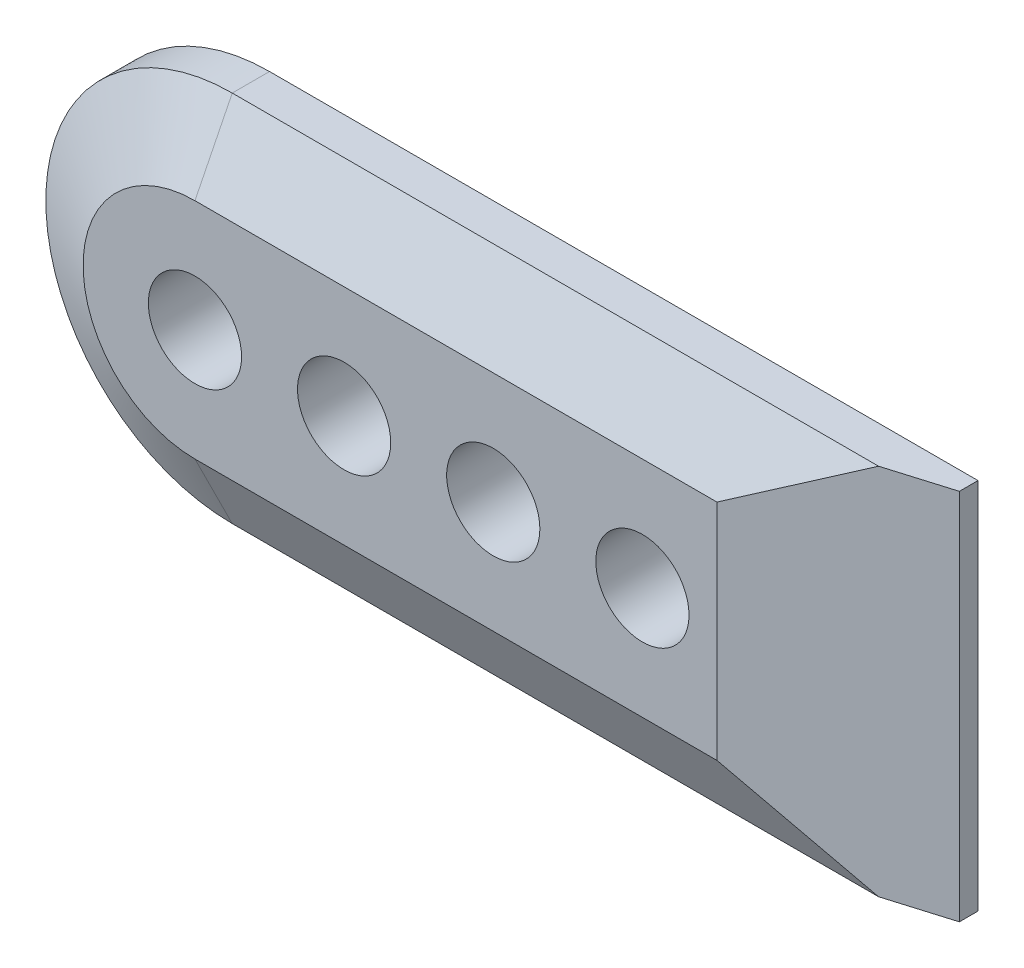
ISO-10303-21;
HEADER;
FILE_DESCRIPTION(('STEP AP214'),'2;1');
FILE_NAME('part.step','',(''),(''),'','','');
FILE_SCHEMA(('AUTOMOTIVE_DESIGN { 1 0 10303 214 1 1 1 1 }'));
ENDSEC;
DATA;
#1=APPLICATION_CONTEXT('core data for automotive mechanical design processes');
#2=APPLICATION_PROTOCOL_DEFINITION('international standard','automotive_design',2000,#1);
#3=PRODUCT_CONTEXT('',#1,'mechanical');
#4=PRODUCT('Part','Part','',(#3));
#5=PRODUCT_RELATED_PRODUCT_CATEGORY('part','',(#4));
#6=PRODUCT_DEFINITION_FORMATION('','',#4);
#7=PRODUCT_DEFINITION_CONTEXT('part definition',#1,'design');
#8=PRODUCT_DEFINITION('design','',#6,#7);
#9=PRODUCT_DEFINITION_SHAPE('','',#8);
#10=(LENGTH_UNIT() NAMED_UNIT(*) SI_UNIT(.MILLI.,.METRE.));
#11=(NAMED_UNIT(*) PLANE_ANGLE_UNIT() SI_UNIT($,.RADIAN.));
#12=(NAMED_UNIT(*) SI_UNIT($,.STERADIAN.) SOLID_ANGLE_UNIT());
#13=UNCERTAINTY_MEASURE_WITH_UNIT(LENGTH_MEASURE(1.E-05),#10,'distance_accuracy_value','');
#14=(GEOMETRIC_REPRESENTATION_CONTEXT(3) GLOBAL_UNCERTAINTY_ASSIGNED_CONTEXT((#13)) GLOBAL_UNIT_ASSIGNED_CONTEXT((#10,
#11,#12)) REPRESENTATION_CONTEXT('',''));
#15=CARTESIAN_POINT('',(0.,0.,0.));
#16=DIRECTION('',(0.,0.,1.));
#17=DIRECTION('',(1.,0.,0.));
#18=AXIS2_PLACEMENT_3D('',#15,#16,#17);
#19=CARTESIAN_POINT('',(0.,1250.,500.));
#20=DIRECTION('',(0.,0.,-1.));
#21=DIRECTION('',(-1.,0.,0.));
#22=AXIS2_PLACEMENT_3D('',#19,#20,#21);
#23=CYLINDRICAL_SURFACE('',#22,1250.);
#24=DIRECTION('',(0.,0.,-1.));
#25=VECTOR('',#24,1.);
#26=CARTESIAN_POINT('',(0.,0.,500.));
#27=LINE('',#26,#25);
#28=CARTESIAN_POINT('',(0.,0.,249.999999999999));
#29=VERTEX_POINT('',#28);
#30=CARTESIAN_POINT('',(0.,0.,0.));
#31=VERTEX_POINT('',#30);
#32=EDGE_CURVE('E100',#29,#31,#27,.T.);
#33=ORIENTED_EDGE('',*,*,#32,.F.);
#34=CARTESIAN_POINT('',(0.,1250.,249.999999999999));
#35=DIRECTION('',(0.,0.,1.));
#36=DIRECTION('',(1.,0.,0.));
#37=AXIS2_PLACEMENT_3D('',#34,#35,#36);
#38=CIRCLE('',#37,1250.);
#39=CARTESIAN_POINT('',(0.,2500.,249.999999999999));
#40=VERTEX_POINT('',#39);
#41=EDGE_CURVE('E163',#29,#40,#38,.F.);
#42=ORIENTED_EDGE('',*,*,#41,.T.);
#43=DIRECTION('',(0.,0.,-1.));
#44=VECTOR('',#43,1.);
#45=CARTESIAN_POINT('',(0.,2500.,500.));
#46=LINE('',#45,#44);
#47=CARTESIAN_POINT('',(0.,2500.,0.));
#48=VERTEX_POINT('',#47);
#49=EDGE_CURVE('E123',#40,#48,#46,.T.);
#50=ORIENTED_EDGE('',*,*,#49,.T.);
#51=CARTESIAN_POINT('',(0.,1250.,0.));
#52=DIRECTION('',(0.,0.,1.));
#53=DIRECTION('',(1.,0.,0.));
#54=AXIS2_PLACEMENT_3D('',#51,#52,#53);
#55=CIRCLE('',#54,1250.);
#56=EDGE_CURVE('E117',#48,#31,#55,.T.);
#57=ORIENTED_EDGE('',*,*,#56,.T.);
#58=EDGE_LOOP('',(#33,#42,#50,#57));
#59=FACE_BOUND('',#58,.T.);
#60=ADVANCED_FACE('F41',(#59),#23,.T.);
#61=CARTESIAN_POINT('',(0.,0.,500.));
#62=DIRECTION('',(0.,1.,0.));
#63=DIRECTION('',(0.,0.,1.));
#64=AXIS2_PLACEMENT_3D('',#61,#62,#63);
#65=PLANE('',#64);
#66=DIRECTION('',(0.,0.,-1.));
#67=VECTOR('',#66,1.);
#68=CARTESIAN_POINT('',(4750.,0.,500.));
#69=LINE('',#68,#67);
#70=CARTESIAN_POINT('',(4750.,0.,125.));
#71=VERTEX_POINT('',#70);
#72=CARTESIAN_POINT('',(4750.,0.,0.));
#73=VERTEX_POINT('',#72);
#74=EDGE_CURVE('E111',#71,#73,#69,.T.);
#75=ORIENTED_EDGE('',*,*,#74,.F.);
#76=DIRECTION('',(-0.957826285221152,0.,0.287347885566342));
#77=VECTOR('',#76,1.);
#78=CARTESIAN_POINT('',(3499.99999999999,0.,500.));
#79=LINE('',#78,#77);
#80=CARTESIAN_POINT('',(4333.33333333333,0.,249.999999999999));
#81=VERTEX_POINT('',#80);
#82=EDGE_CURVE('E51',#71,#81,#79,.T.);
#83=ORIENTED_EDGE('',*,*,#82,.T.);
#84=DIRECTION('',(-1.,0.,0.));
#85=VECTOR('',#84,1.);
#86=CARTESIAN_POINT('',(0.,0.,249.999999999999));
#87=LINE('',#86,#85);
#88=EDGE_CURVE('E105',#81,#29,#87,.T.);
#89=ORIENTED_EDGE('',*,*,#88,.T.);
#90=ORIENTED_EDGE('',*,*,#32,.T.);
#91=DIRECTION('',(1.,0.,0.));
#92=VECTOR('',#91,1.);
#93=CARTESIAN_POINT('',(0.,0.,0.));
#94=LINE('',#93,#92);
#95=EDGE_CURVE('E103',#31,#73,#94,.T.);
#96=ORIENTED_EDGE('',*,*,#95,.T.);
#97=EDGE_LOOP('',(#75,#83,#89,#90,#96));
#98=FACE_BOUND('',#97,.T.);
#99=ADVANCED_FACE('F102',(#98),#65,.F.);
#100=CARTESIAN_POINT('',(4750.,2500.,500.));
#101=DIRECTION('',(-1.,0.,0.));
#102=DIRECTION('',(0.,0.,1.));
#103=AXIS2_PLACEMENT_3D('',#100,#101,#102);
#104=PLANE('',#103);
#105=DIRECTION('',(0.,0.,-1.));
#106=VECTOR('',#105,1.);
#107=CARTESIAN_POINT('',(4750.,2500.,500.));
#108=LINE('',#107,#106);
#109=CARTESIAN_POINT('',(4750.,2500.,125.));
#110=VERTEX_POINT('',#109);
#111=CARTESIAN_POINT('',(4750.,2500.,0.));
#112=VERTEX_POINT('',#111);
#113=EDGE_CURVE('E143',#110,#112,#108,.T.);
#114=ORIENTED_EDGE('',*,*,#113,.F.);
#115=DIRECTION('',(0.,-1.,0.));
#116=VECTOR('',#115,1.);
#117=CARTESIAN_POINT('',(4750.,500.000000000004,125.));
#118=LINE('',#117,#116);
#119=EDGE_CURVE('E65',#110,#71,#118,.T.);
#120=ORIENTED_EDGE('',*,*,#119,.T.);
#121=ORIENTED_EDGE('',*,*,#74,.T.);
#122=DIRECTION('',(0.,1.,0.));
#123=VECTOR('',#122,1.);
#124=CARTESIAN_POINT('',(4750.,2500.,0.));
#125=LINE('',#124,#123);
#126=EDGE_CURVE('E119',#73,#112,#125,.T.);
#127=ORIENTED_EDGE('',*,*,#126,.T.);
#128=EDGE_LOOP('',(#114,#120,#121,#127));
#129=FACE_BOUND('',#128,.T.);
#130=ADVANCED_FACE('F187',(#129),#104,.F.);
#131=CARTESIAN_POINT('',(0.,2500.,500.));
#132=DIRECTION('',(0.,-1.,0.));
#133=DIRECTION('',(0.,0.,-1.));
#134=AXIS2_PLACEMENT_3D('',#131,#132,#133);
#135=PLANE('',#134);
#136=DIRECTION('',(1.,0.,0.));
#137=VECTOR('',#136,1.);
#138=CARTESIAN_POINT('',(4750.,2500.,249.999999999999));
#139=LINE('',#138,#137);
#140=CARTESIAN_POINT('',(4333.33333333333,2500.,249.999999999999));
#141=VERTEX_POINT('',#140);
#142=EDGE_CURVE('E157',#40,#141,#139,.T.);
#143=ORIENTED_EDGE('',*,*,#142,.T.);
#144=DIRECTION('',(0.957826285221152,0.,-0.287347885566342));
#145=VECTOR('',#144,1.);
#146=CARTESIAN_POINT('',(3499.99999999999,2500.,500.));
#147=LINE('',#146,#145);
#148=EDGE_CURVE('E177',#141,#110,#147,.T.);
#149=ORIENTED_EDGE('',*,*,#148,.T.);
#150=ORIENTED_EDGE('',*,*,#113,.T.);
#151=DIRECTION('',(-1.,0.,0.));
#152=VECTOR('',#151,1.);
#153=CARTESIAN_POINT('',(0.,2500.,0.));
#154=LINE('',#153,#152);
#155=EDGE_CURVE('E138',#112,#48,#154,.T.);
#156=ORIENTED_EDGE('',*,*,#155,.T.);
#157=ORIENTED_EDGE('',*,*,#49,.F.);
#158=EDGE_LOOP('',(#143,#149,#150,#156,#157));
#159=FACE_BOUND('',#158,.T.);
#160=ADVANCED_FACE('F184',(#159),#135,.F.);
#161=CARTESIAN_POINT('',(0.,1250.,500.));
#162=DIRECTION('',(0.,0.,1.));
#163=DIRECTION('',(1.,0.,0.));
#164=AXIS2_PLACEMENT_3D('',#161,#162,#163);
#165=PLANE('',#164);
#166=CARTESIAN_POINT('',(3000.,1250.,500.));
#167=DIRECTION('',(0.,0.,1.));
#168=DIRECTION('',(1.,0.,0.));
#169=AXIS2_PLACEMENT_3D('',#166,#167,#168);
#170=CIRCLE('',#169,312.5);
#171=CARTESIAN_POINT('',(3312.5,1250.,500.));
#172=VERTEX_POINT('',#171);
#173=EDGE_CURVE('E250',#172,#172,#170,.T.);
#174=ORIENTED_EDGE('',*,*,#173,.F.);
#175=EDGE_LOOP('',(#174));
#176=FACE_BOUND('',#175,.T.);
#177=CARTESIAN_POINT('',(2000.,1250.,500.));
#178=DIRECTION('',(0.,0.,1.));
#179=DIRECTION('',(1.,0.,0.));
#180=AXIS2_PLACEMENT_3D('',#177,#178,#179);
#181=CIRCLE('',#180,312.5);
#182=CARTESIAN_POINT('',(2312.5,1250.,500.));
#183=VERTEX_POINT('',#182);
#184=EDGE_CURVE('E252',#183,#183,#181,.T.);
#185=ORIENTED_EDGE('',*,*,#184,.F.);
#186=EDGE_LOOP('',(#185));
#187=FACE_BOUND('',#186,.T.);
#188=CARTESIAN_POINT('',(1000.,1250.,500.));
#189=DIRECTION('',(0.,0.,1.));
#190=DIRECTION('',(1.,0.,0.));
#191=AXIS2_PLACEMENT_3D('',#188,#189,#190);
#192=CIRCLE('',#191,312.5);
#193=CARTESIAN_POINT('',(1312.5,1250.,500.));
#194=VERTEX_POINT('',#193);
#195=EDGE_CURVE('E264',#194,#194,#192,.T.);
#196=ORIENTED_EDGE('',*,*,#195,.F.);
#197=EDGE_LOOP('',(#196));
#198=FACE_BOUND('',#197,.T.);
#199=CARTESIAN_POINT('',(0.,1250.,500.));
#200=DIRECTION('',(0.,0.,1.));
#201=DIRECTION('',(1.,0.,0.));
#202=AXIS2_PLACEMENT_3D('',#199,#200,#201);
#203=CIRCLE('',#202,312.5);
#204=CARTESIAN_POINT('',(312.5,1250.,500.));
#205=VERTEX_POINT('',#204);
#206=EDGE_CURVE('E271',#205,#205,#203,.T.);
#207=ORIENTED_EDGE('',*,*,#206,.F.);
#208=EDGE_LOOP('',(#207));
#209=FACE_BOUND('',#208,.T.);
#210=DIRECTION('',(1.,0.,0.));
#211=VECTOR('',#210,1.);
#212=CARTESIAN_POINT('',(4750.,500.000000000004,500.));
#213=LINE('',#212,#211);
#214=CARTESIAN_POINT('',(0.,500.000000000004,500.));
#215=VERTEX_POINT('',#214);
#216=CARTESIAN_POINT('',(3499.99999999999,500.000000000004,500.));
#217=VERTEX_POINT('',#216);
#218=EDGE_CURVE('E150',#215,#217,#213,.T.);
#219=ORIENTED_EDGE('',*,*,#218,.T.);
#220=DIRECTION('',(0.,1.,0.));
#221=VECTOR('',#220,1.);
#222=CARTESIAN_POINT('',(3499.99999999999,2000.,500.));
#223=LINE('',#222,#221);
#224=CARTESIAN_POINT('',(3499.99999999999,2000.,500.));
#225=VERTEX_POINT('',#224);
#226=EDGE_CURVE('E166',#217,#225,#223,.T.);
#227=ORIENTED_EDGE('',*,*,#226,.T.);
#228=DIRECTION('',(-1.,0.,0.));
#229=VECTOR('',#228,1.);
#230=CARTESIAN_POINT('',(0.,2000.,500.));
#231=LINE('',#230,#229);
#232=CARTESIAN_POINT('',(0.,2000.,500.));
#233=VERTEX_POINT('',#232);
#234=EDGE_CURVE('E154',#225,#233,#231,.T.);
#235=ORIENTED_EDGE('',*,*,#234,.T.);
#236=CARTESIAN_POINT('',(0.,1250.,500.));
#237=DIRECTION('',(0.,0.,1.));
#238=DIRECTION('',(1.,0.,0.));
#239=AXIS2_PLACEMENT_3D('',#236,#237,#238);
#240=CIRCLE('',#239,749.999999999996);
#241=EDGE_CURVE('E110',#233,#215,#240,.T.);
#242=ORIENTED_EDGE('',*,*,#241,.T.);
#243=EDGE_LOOP('',(#219,#227,#235,#242));
#244=FACE_BOUND('',#243,.T.);
#245=ADVANCED_FACE('F194',(#176,#187,#198,#209,#244),#165,.T.);
#246=CARTESIAN_POINT('',(0.,1250.,0.));
#247=DIRECTION('',(0.,0.,1.));
#248=DIRECTION('',(1.,0.,0.));
#249=AXIS2_PLACEMENT_3D('',#246,#247,#248);
#250=PLANE('',#249);
#251=CARTESIAN_POINT('',(3000.,1250.,0.));
#252=DIRECTION('',(0.,0.,1.));
#253=DIRECTION('',(1.,0.,0.));
#254=AXIS2_PLACEMENT_3D('',#251,#252,#253);
#255=CIRCLE('',#254,312.5);
#256=CARTESIAN_POINT('',(3312.5,1250.,0.));
#257=VERTEX_POINT('',#256);
#258=EDGE_CURVE('E169',#257,#257,#255,.T.);
#259=ORIENTED_EDGE('',*,*,#258,.T.);
#260=EDGE_LOOP('',(#259));
#261=FACE_BOUND('',#260,.T.);
#262=CARTESIAN_POINT('',(2000.,1250.,0.));
#263=DIRECTION('',(0.,0.,1.));
#264=DIRECTION('',(1.,0.,0.));
#265=AXIS2_PLACEMENT_3D('',#262,#263,#264);
#266=CIRCLE('',#265,312.5);
#267=CARTESIAN_POINT('',(2312.5,1250.,0.));
#268=VERTEX_POINT('',#267);
#269=EDGE_CURVE('E258',#268,#268,#266,.T.);
#270=ORIENTED_EDGE('',*,*,#269,.T.);
#271=EDGE_LOOP('',(#270));
#272=FACE_BOUND('',#271,.T.);
#273=CARTESIAN_POINT('',(1000.,1250.,0.));
#274=DIRECTION('',(0.,0.,1.));
#275=DIRECTION('',(1.,0.,0.));
#276=AXIS2_PLACEMENT_3D('',#273,#274,#275);
#277=CIRCLE('',#276,312.5);
#278=CARTESIAN_POINT('',(1312.5,1250.,0.));
#279=VERTEX_POINT('',#278);
#280=EDGE_CURVE('E268',#279,#279,#277,.T.);
#281=ORIENTED_EDGE('',*,*,#280,.T.);
#282=EDGE_LOOP('',(#281));
#283=FACE_BOUND('',#282,.T.);
#284=CARTESIAN_POINT('',(0.,1250.,0.));
#285=DIRECTION('',(0.,0.,1.));
#286=DIRECTION('',(1.,0.,0.));
#287=AXIS2_PLACEMENT_3D('',#284,#285,#286);
#288=CIRCLE('',#287,312.5);
#289=CARTESIAN_POINT('',(312.5,1250.,0.));
#290=VERTEX_POINT('',#289);
#291=EDGE_CURVE('E133',#290,#290,#288,.T.);
#292=ORIENTED_EDGE('',*,*,#291,.T.);
#293=EDGE_LOOP('',(#292));
#294=FACE_BOUND('',#293,.T.);
#295=ORIENTED_EDGE('',*,*,#56,.F.);
#296=ORIENTED_EDGE('',*,*,#155,.F.);
#297=ORIENTED_EDGE('',*,*,#126,.F.);
#298=ORIENTED_EDGE('',*,*,#95,.F.);
#299=EDGE_LOOP('',(#295,#296,#297,#298));
#300=FACE_BOUND('',#299,.T.);
#301=ADVANCED_FACE('F115',(#261,#272,#283,#294,#300),#250,.F.);
#302=CARTESIAN_POINT('',(0.,500.000000000004,500.));
#303=DIRECTION('',(0.,-0.447213595499956,0.894427190999917));
#304=DIRECTION('',(-1.,0.,0.));
#305=AXIS2_PLACEMENT_3D('',#302,#303,#304);
#306=PLANE('',#305);
#307=ORIENTED_EDGE('',*,*,#88,.F.);
#308=DIRECTION('',(-0.830454798537402,0.498272879122438,0.249136439561218));
#309=VECTOR('',#308,1.);
#310=CARTESIAN_POINT('',(1086.20689655171,1948.27586206896,1224.13793103448));
#311=LINE('',#310,#309);
#312=EDGE_CURVE('E11',#81,#217,#311,.T.);
#313=ORIENTED_EDGE('',*,*,#312,.T.);
#314=ORIENTED_EDGE('',*,*,#218,.F.);
#315=DIRECTION('',(0.,0.894427190999917,0.447213595499956));
#316=VECTOR('',#315,1.);
#317=CARTESIAN_POINT('',(0.,0.,249.999999999999));
#318=LINE('',#317,#316);
#319=EDGE_CURVE('E126',#29,#215,#318,.T.);
#320=ORIENTED_EDGE('',*,*,#319,.F.);
#321=EDGE_LOOP('',(#307,#313,#314,#320));
#322=FACE_BOUND('',#321,.T.);
#323=ADVANCED_FACE('F192',(#322),#306,.T.);
#324=CARTESIAN_POINT('',(0.,1250.,500.));
#325=DIRECTION('',(0.,0.,-1.));
#326=DIRECTION('',(-1.,0.,0.));
#327=AXIS2_PLACEMENT_3D('',#324,#325,#326);
#328=CONICAL_SURFACE('',#327,749.999999999996,1.10714871779409);
#329=ORIENTED_EDGE('',*,*,#319,.T.);
#330=ORIENTED_EDGE('',*,*,#241,.F.);
#331=DIRECTION('',(0.,-0.894427190999917,0.447213595499956));
#332=VECTOR('',#331,1.);
#333=CARTESIAN_POINT('',(0.,2500.,249.999999999999));
#334=LINE('',#333,#332);
#335=EDGE_CURVE('E130',#40,#233,#334,.T.);
#336=ORIENTED_EDGE('',*,*,#335,.F.);
#337=ORIENTED_EDGE('',*,*,#41,.F.);
#338=EDGE_LOOP('',(#329,#330,#336,#337));
#339=FACE_BOUND('',#338,.T.);
#340=ADVANCED_FACE('F199',(#339),#328,.T.);
#341=CARTESIAN_POINT('',(0.,2000.,500.));
#342=DIRECTION('',(0.,0.447213595499956,0.894427190999917));
#343=DIRECTION('',(1.,0.,0.));
#344=AXIS2_PLACEMENT_3D('',#341,#342,#343);
#345=PLANE('',#344);
#346=ORIENTED_EDGE('',*,*,#234,.F.);
#347=DIRECTION('',(0.830454798537402,0.498272879122438,-0.249136439561218));
#348=VECTOR('',#347,1.);
#349=CARTESIAN_POINT('',(1086.20689655171,551.72413793104,1224.13793103448));
#350=LINE('',#349,#348);
#351=EDGE_CURVE('E174',#225,#141,#350,.T.);
#352=ORIENTED_EDGE('',*,*,#351,.T.);
#353=ORIENTED_EDGE('',*,*,#142,.F.);
#354=ORIENTED_EDGE('',*,*,#335,.T.);
#355=EDGE_LOOP('',(#346,#352,#353,#354));
#356=FACE_BOUND('',#355,.T.);
#357=ADVANCED_FACE('F202',(#356),#345,.T.);
#358=CARTESIAN_POINT('',(3499.99999999999,1250.,500.));
#359=DIRECTION('',(0.287347885566342,0.,0.957826285221152));
#360=DIRECTION('',(0.,-1.,0.));
#361=AXIS2_PLACEMENT_3D('',#358,#359,#360);
#362=PLANE('',#361);
#363=ORIENTED_EDGE('',*,*,#82,.F.);
#364=ORIENTED_EDGE('',*,*,#119,.F.);
#365=ORIENTED_EDGE('',*,*,#148,.F.);
#366=ORIENTED_EDGE('',*,*,#351,.F.);
#367=ORIENTED_EDGE('',*,*,#226,.F.);
#368=ORIENTED_EDGE('',*,*,#312,.F.);
#369=EDGE_LOOP('',(#363,#364,#365,#366,#367,#368));
#370=FACE_BOUND('',#369,.T.);
#371=ADVANCED_FACE('F44',(#370),#362,.T.);
#372=CARTESIAN_POINT('',(0.,1250.,0.));
#373=DIRECTION('',(0.,0.,1.));
#374=DIRECTION('',(1.,0.,0.));
#375=AXIS2_PLACEMENT_3D('',#372,#373,#374);
#376=CYLINDRICAL_SURFACE('',#375,312.5);
#377=ORIENTED_EDGE('',*,*,#291,.F.);
#378=EDGE_LOOP('',(#377));
#379=FACE_BOUND('',#378,.T.);
#380=ORIENTED_EDGE('',*,*,#206,.T.);
#381=EDGE_LOOP('',(#380));
#382=FACE_BOUND('',#381,.T.);
#383=ADVANCED_FACE('F209',(#379,#382),#376,.F.);
#384=CARTESIAN_POINT('',(1000.,1250.,0.));
#385=DIRECTION('',(0.,0.,1.));
#386=DIRECTION('',(1.,0.,0.));
#387=AXIS2_PLACEMENT_3D('',#384,#385,#386);
#388=CYLINDRICAL_SURFACE('',#387,312.5);
#389=ORIENTED_EDGE('',*,*,#280,.F.);
#390=EDGE_LOOP('',(#389));
#391=FACE_BOUND('',#390,.T.);
#392=ORIENTED_EDGE('',*,*,#195,.T.);
#393=EDGE_LOOP('',(#392));
#394=FACE_BOUND('',#393,.T.);
#395=ADVANCED_FACE('F231',(#391,#394),#388,.F.);
#396=CARTESIAN_POINT('',(2000.,1250.,0.));
#397=DIRECTION('',(0.,0.,1.));
#398=DIRECTION('',(1.,0.,0.));
#399=AXIS2_PLACEMENT_3D('',#396,#397,#398);
#400=CYLINDRICAL_SURFACE('',#399,312.5);
#401=ORIENTED_EDGE('',*,*,#269,.F.);
#402=EDGE_LOOP('',(#401));
#403=FACE_BOUND('',#402,.T.);
#404=ORIENTED_EDGE('',*,*,#184,.T.);
#405=EDGE_LOOP('',(#404));
#406=FACE_BOUND('',#405,.T.);
#407=ADVANCED_FACE('F235',(#403,#406),#400,.F.);
#408=CARTESIAN_POINT('',(3000.,1250.,0.));
#409=DIRECTION('',(0.,0.,1.));
#410=DIRECTION('',(1.,0.,0.));
#411=AXIS2_PLACEMENT_3D('',#408,#409,#410);
#412=CYLINDRICAL_SURFACE('',#411,312.5);
#413=ORIENTED_EDGE('',*,*,#258,.F.);
#414=EDGE_LOOP('',(#413));
#415=FACE_BOUND('',#414,.T.);
#416=ORIENTED_EDGE('',*,*,#173,.T.);
#417=EDGE_LOOP('',(#416));
#418=FACE_BOUND('',#417,.T.);
#419=ADVANCED_FACE('F239',(#415,#418),#412,.F.);
#420=CLOSED_SHELL('',(#60,#99,#130,#160,#245,#301,#323,#340,#357,#371,#383,#395,#407,#419));
#421=MANIFOLD_SOLID_BREP('B2',#420);
#422=ADVANCED_BREP_SHAPE_REPRESENTATION('',(#18,#421),#14);
#423=SHAPE_DEFINITION_REPRESENTATION(#9,#422);
ENDSEC;
END-ISO-10303-21;
